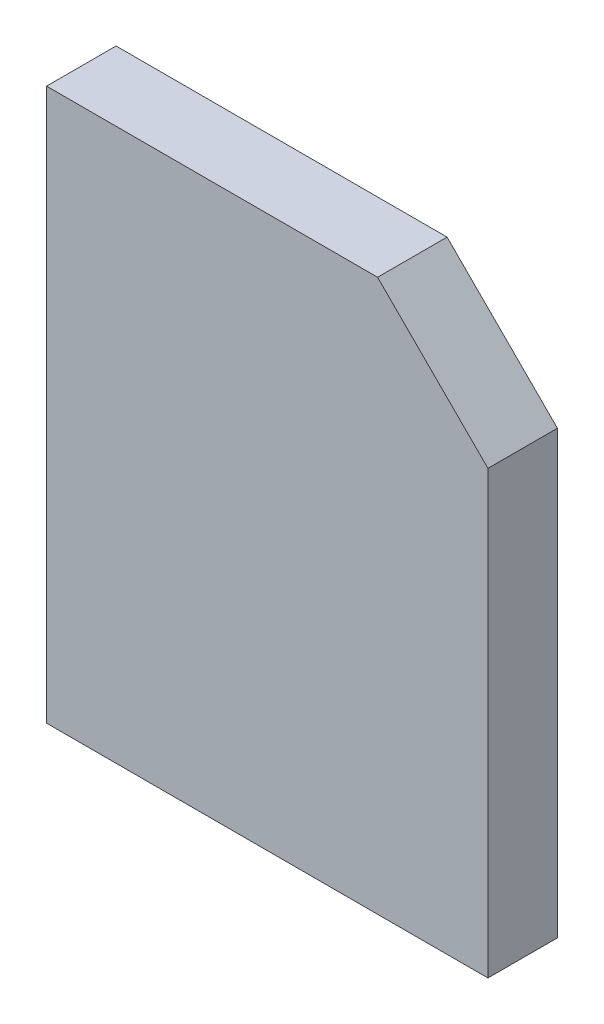
ISO-10303-21;
HEADER;
FILE_DESCRIPTION(('STEP AP214'),'2;1');
FILE_NAME('part.step','',(''),(''),'','','');
FILE_SCHEMA(('AUTOMOTIVE_DESIGN { 1 0 10303 214 1 1 1 1 }'));
ENDSEC;
DATA;
#1=APPLICATION_CONTEXT('core data for automotive mechanical design processes');
#2=APPLICATION_PROTOCOL_DEFINITION('international standard','automotive_design',2000,#1);
#3=PRODUCT_CONTEXT('',#1,'mechanical');
#4=PRODUCT('Part','Part','',(#3));
#5=PRODUCT_RELATED_PRODUCT_CATEGORY('part','',(#4));
#6=PRODUCT_DEFINITION_FORMATION('','',#4);
#7=PRODUCT_DEFINITION_CONTEXT('part definition',#1,'design');
#8=PRODUCT_DEFINITION('design','',#6,#7);
#9=PRODUCT_DEFINITION_SHAPE('','',#8);
#10=(LENGTH_UNIT() NAMED_UNIT(*) SI_UNIT(.MILLI.,.METRE.));
#11=(NAMED_UNIT(*) PLANE_ANGLE_UNIT() SI_UNIT($,.RADIAN.));
#12=(NAMED_UNIT(*) SI_UNIT($,.STERADIAN.) SOLID_ANGLE_UNIT());
#13=UNCERTAINTY_MEASURE_WITH_UNIT(LENGTH_MEASURE(1.E-05),#10,'distance_accuracy_value','');
#14=(GEOMETRIC_REPRESENTATION_CONTEXT(3) GLOBAL_UNCERTAINTY_ASSIGNED_CONTEXT((#13)) GLOBAL_UNIT_ASSIGNED_CONTEXT((#10,
#11,#12)) REPRESENTATION_CONTEXT('',''));
#15=CARTESIAN_POINT('',(0.,0.,0.));
#16=DIRECTION('',(0.,0.,1.));
#17=DIRECTION('',(1.,0.,0.));
#18=AXIS2_PLACEMENT_3D('',#15,#16,#17);
#19=CARTESIAN_POINT('',(5.08,3.81,3.9));
#20=DIRECTION('',(-0.707106781186547,-0.707106781186548,0.));
#21=DIRECTION('',(0.707106781186548,-0.707106781186547,0.));
#22=AXIS2_PLACEMENT_3D('',#19,#20,#21);
#23=PLANE('',#22);
#24=DIRECTION('',(-0.707106781186548,0.707106781186547,0.));
#25=VECTOR('',#24,1.);
#26=CARTESIAN_POINT('',(5.08,3.81,2.3));
#27=LINE('',#26,#25);
#28=CARTESIAN_POINT('',(5.08,3.81,2.3));
#29=VERTEX_POINT('',#28);
#30=CARTESIAN_POINT('',(2.54,6.35,2.3));
#31=VERTEX_POINT('',#30);
#32=EDGE_CURVE('E112',#29,#31,#27,.T.);
#33=ORIENTED_EDGE('',*,*,#32,.T.);
#34=DIRECTION('',(0.,0.,-1.));
#35=VECTOR('',#34,1.);
#36=CARTESIAN_POINT('',(2.54,6.35,3.9));
#37=LINE('',#36,#35);
#38=CARTESIAN_POINT('',(2.54,6.35,3.9));
#39=VERTEX_POINT('',#38);
#40=EDGE_CURVE('E11',#39,#31,#37,.T.);
#41=ORIENTED_EDGE('',*,*,#40,.F.);
#42=DIRECTION('',(-0.707106781186548,0.707106781186547,0.));
#43=VECTOR('',#42,1.);
#44=CARTESIAN_POINT('',(5.08,3.81,3.9));
#45=LINE('',#44,#43);
#46=CARTESIAN_POINT('',(5.08,3.81,3.9));
#47=VERTEX_POINT('',#46);
#48=EDGE_CURVE('E120',#47,#39,#45,.T.);
#49=ORIENTED_EDGE('',*,*,#48,.F.);
#50=DIRECTION('',(0.,0.,-1.));
#51=VECTOR('',#50,1.);
#52=CARTESIAN_POINT('',(5.08,3.81,3.9));
#53=LINE('',#52,#51);
#54=EDGE_CURVE('E108',#47,#29,#53,.T.);
#55=ORIENTED_EDGE('',*,*,#54,.T.);
#56=EDGE_LOOP('',(#33,#41,#49,#55));
#57=FACE_BOUND('',#56,.T.);
#58=ADVANCED_FACE('F38',(#57),#23,.F.);
#59=CARTESIAN_POINT('',(-5.08000000000001,6.35,3.9));
#60=DIRECTION('',(0.,-1.,0.));
#61=DIRECTION('',(1.,0.,0.));
#62=AXIS2_PLACEMENT_3D('',#59,#60,#61);
#63=PLANE('',#62);
#64=DIRECTION('',(-1.,0.,0.));
#65=VECTOR('',#64,1.);
#66=CARTESIAN_POINT('',(-5.08000000000001,6.35,2.3));
#67=LINE('',#66,#65);
#68=CARTESIAN_POINT('',(-5.08000000000001,6.35,2.3));
#69=VERTEX_POINT('',#68);
#70=EDGE_CURVE('E115',#31,#69,#67,.T.);
#71=ORIENTED_EDGE('',*,*,#70,.T.);
#72=DIRECTION('',(0.,0.,-1.));
#73=VECTOR('',#72,1.);
#74=CARTESIAN_POINT('',(-5.08000000000001,6.35,3.9));
#75=LINE('',#74,#73);
#76=CARTESIAN_POINT('',(-5.08000000000001,6.35,3.9));
#77=VERTEX_POINT('',#76);
#78=EDGE_CURVE('E46',#77,#69,#75,.T.);
#79=ORIENTED_EDGE('',*,*,#78,.F.);
#80=DIRECTION('',(-1.,0.,0.));
#81=VECTOR('',#80,1.);
#82=CARTESIAN_POINT('',(-5.08000000000001,6.35,3.9));
#83=LINE('',#82,#81);
#84=EDGE_CURVE('E88',#39,#77,#83,.T.);
#85=ORIENTED_EDGE('',*,*,#84,.F.);
#86=ORIENTED_EDGE('',*,*,#40,.T.);
#87=EDGE_LOOP('',(#71,#79,#85,#86));
#88=FACE_BOUND('',#87,.T.);
#89=ADVANCED_FACE('F139',(#88),#63,.F.);
#90=CARTESIAN_POINT('',(-5.08,-6.35,3.9));
#91=DIRECTION('',(1.,0.,0.));
#92=DIRECTION('',(0.,1.,0.));
#93=AXIS2_PLACEMENT_3D('',#90,#91,#92);
#94=PLANE('',#93);
#95=DIRECTION('',(0.,-1.,0.));
#96=VECTOR('',#95,1.);
#97=CARTESIAN_POINT('',(-5.08,-6.35,2.3));
#98=LINE('',#97,#96);
#99=CARTESIAN_POINT('',(-5.08,-6.35,2.3));
#100=VERTEX_POINT('',#99);
#101=EDGE_CURVE('E103',#69,#100,#98,.T.);
#102=ORIENTED_EDGE('',*,*,#101,.T.);
#103=DIRECTION('',(0.,0.,-1.));
#104=VECTOR('',#103,1.);
#105=CARTESIAN_POINT('',(-5.08,-6.35,3.9));
#106=LINE('',#105,#104);
#107=CARTESIAN_POINT('',(-5.08,-6.35,3.9));
#108=VERTEX_POINT('',#107);
#109=EDGE_CURVE('E100',#108,#100,#106,.T.);
#110=ORIENTED_EDGE('',*,*,#109,.F.);
#111=DIRECTION('',(0.,-1.,0.));
#112=VECTOR('',#111,1.);
#113=CARTESIAN_POINT('',(-5.08,-6.35,3.9));
#114=LINE('',#113,#112);
#115=EDGE_CURVE('E92',#77,#108,#114,.T.);
#116=ORIENTED_EDGE('',*,*,#115,.F.);
#117=ORIENTED_EDGE('',*,*,#78,.T.);
#118=EDGE_LOOP('',(#102,#110,#116,#117));
#119=FACE_BOUND('',#118,.T.);
#120=ADVANCED_FACE('F101',(#119),#94,.F.);
#121=CARTESIAN_POINT('',(-5.08,-6.35,3.9));
#122=DIRECTION('',(0.,1.,0.));
#123=DIRECTION('',(-1.,0.,0.));
#124=AXIS2_PLACEMENT_3D('',#121,#122,#123);
#125=PLANE('',#124);
#126=DIRECTION('',(1.,0.,0.));
#127=VECTOR('',#126,1.);
#128=CARTESIAN_POINT('',(-5.08,-6.35,2.3));
#129=LINE('',#128,#127);
#130=CARTESIAN_POINT('',(5.08,-6.35,2.3));
#131=VERTEX_POINT('',#130);
#132=EDGE_CURVE('E74',#100,#131,#129,.T.);
#133=ORIENTED_EDGE('',*,*,#132,.T.);
#134=DIRECTION('',(0.,0.,-1.));
#135=VECTOR('',#134,1.);
#136=CARTESIAN_POINT('',(5.08,-6.35,3.9));
#137=LINE('',#136,#135);
#138=CARTESIAN_POINT('',(5.08,-6.35,3.9));
#139=VERTEX_POINT('',#138);
#140=EDGE_CURVE('E104',#139,#131,#137,.T.);
#141=ORIENTED_EDGE('',*,*,#140,.F.);
#142=DIRECTION('',(1.,0.,0.));
#143=VECTOR('',#142,1.);
#144=CARTESIAN_POINT('',(-5.08,-6.35,3.9));
#145=LINE('',#144,#143);
#146=EDGE_CURVE('E96',#108,#139,#145,.T.);
#147=ORIENTED_EDGE('',*,*,#146,.F.);
#148=ORIENTED_EDGE('',*,*,#109,.T.);
#149=EDGE_LOOP('',(#133,#141,#147,#148));
#150=FACE_BOUND('',#149,.T.);
#151=ADVANCED_FACE('F106',(#150),#125,.F.);
#152=CARTESIAN_POINT('',(5.08,-6.35,3.9));
#153=DIRECTION('',(-1.,0.,0.));
#154=DIRECTION('',(0.,-1.,0.));
#155=AXIS2_PLACEMENT_3D('',#152,#153,#154);
#156=PLANE('',#155);
#157=DIRECTION('',(0.,1.,0.));
#158=VECTOR('',#157,1.);
#159=CARTESIAN_POINT('',(5.08,-6.35,2.3));
#160=LINE('',#159,#158);
#161=EDGE_CURVE('E80',#131,#29,#160,.T.);
#162=ORIENTED_EDGE('',*,*,#161,.T.);
#163=ORIENTED_EDGE('',*,*,#54,.F.);
#164=DIRECTION('',(0.,1.,0.));
#165=VECTOR('',#164,1.);
#166=CARTESIAN_POINT('',(5.08,-6.35,3.9));
#167=LINE('',#166,#165);
#168=EDGE_CURVE('E54',#139,#47,#167,.T.);
#169=ORIENTED_EDGE('',*,*,#168,.F.);
#170=ORIENTED_EDGE('',*,*,#140,.T.);
#171=EDGE_LOOP('',(#162,#163,#169,#170));
#172=FACE_BOUND('',#171,.T.);
#173=ADVANCED_FACE('F128',(#172),#156,.F.);
#174=CARTESIAN_POINT('',(0.,0.,3.9));
#175=DIRECTION('',(0.,0.,-1.));
#176=DIRECTION('',(-1.,0.,0.));
#177=AXIS2_PLACEMENT_3D('',#174,#175,#176);
#178=PLANE('',#177);
#179=ORIENTED_EDGE('',*,*,#48,.T.);
#180=ORIENTED_EDGE('',*,*,#84,.T.);
#181=ORIENTED_EDGE('',*,*,#115,.T.);
#182=ORIENTED_EDGE('',*,*,#146,.T.);
#183=ORIENTED_EDGE('',*,*,#168,.T.);
#184=EDGE_LOOP('',(#179,#180,#181,#182,#183));
#185=FACE_BOUND('',#184,.T.);
#186=ADVANCED_FACE('F94',(#185),#178,.F.);
#187=CARTESIAN_POINT('',(0.,0.,2.3));
#188=DIRECTION('',(0.,0.,-1.));
#189=DIRECTION('',(-1.,0.,0.));
#190=AXIS2_PLACEMENT_3D('',#187,#188,#189);
#191=PLANE('',#190);
#192=ORIENTED_EDGE('',*,*,#32,.F.);
#193=ORIENTED_EDGE('',*,*,#161,.F.);
#194=ORIENTED_EDGE('',*,*,#132,.F.);
#195=ORIENTED_EDGE('',*,*,#101,.F.);
#196=ORIENTED_EDGE('',*,*,#70,.F.);
#197=EDGE_LOOP('',(#192,#193,#194,#195,#196));
#198=FACE_BOUND('',#197,.T.);
#199=ADVANCED_FACE('F124',(#198),#191,.T.);
#200=CLOSED_SHELL('',(#58,#89,#120,#151,#173,#186,#199));
#201=MANIFOLD_SOLID_BREP('B2',#200);
#202=ADVANCED_BREP_SHAPE_REPRESENTATION('',(#18,#201),#14);
#203=SHAPE_DEFINITION_REPRESENTATION(#9,#202);
ENDSEC;
END-ISO-10303-21;
